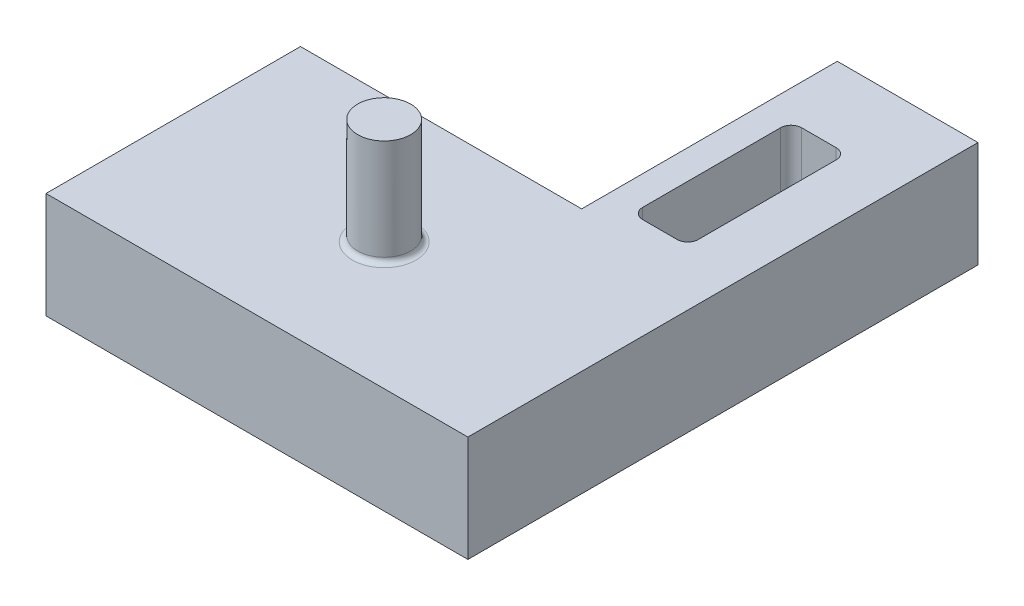
ISO-10303-21;
HEADER;
FILE_DESCRIPTION(('STEP AP214'),'2;1');
FILE_NAME('part.step','',(''),(''),'','','');
FILE_SCHEMA(('AUTOMOTIVE_DESIGN { 1 0 10303 214 1 1 1 1 }'));
ENDSEC;
DATA;
#1=APPLICATION_CONTEXT('core data for automotive mechanical design processes');
#2=APPLICATION_PROTOCOL_DEFINITION('international standard','automotive_design',2000,#1);
#3=PRODUCT_CONTEXT('',#1,'mechanical');
#4=PRODUCT('Part','Part','',(#3));
#5=PRODUCT_RELATED_PRODUCT_CATEGORY('part','',(#4));
#6=PRODUCT_DEFINITION_FORMATION('','',#4);
#7=PRODUCT_DEFINITION_CONTEXT('part definition',#1,'design');
#8=PRODUCT_DEFINITION('design','',#6,#7);
#9=PRODUCT_DEFINITION_SHAPE('','',#8);
#10=(LENGTH_UNIT() NAMED_UNIT(*) SI_UNIT(.MILLI.,.METRE.));
#11=(NAMED_UNIT(*) PLANE_ANGLE_UNIT() SI_UNIT($,.RADIAN.));
#12=(NAMED_UNIT(*) SI_UNIT($,.STERADIAN.) SOLID_ANGLE_UNIT());
#13=UNCERTAINTY_MEASURE_WITH_UNIT(LENGTH_MEASURE(1.E-05),#10,'distance_accuracy_value','');
#14=(GEOMETRIC_REPRESENTATION_CONTEXT(3) GLOBAL_UNCERTAINTY_ASSIGNED_CONTEXT((#13)) GLOBAL_UNIT_ASSIGNED_CONTEXT((#10,
#11,#12)) REPRESENTATION_CONTEXT('',''));
#15=CARTESIAN_POINT('',(0.,0.,0.));
#16=DIRECTION('',(0.,0.,1.));
#17=DIRECTION('',(1.,0.,0.));
#18=AXIS2_PLACEMENT_3D('',#15,#16,#17);
#19=CARTESIAN_POINT('',(0.,10.,0.));
#20=DIRECTION('',(0.,-1.,0.));
#21=DIRECTION('',(0.,0.,-1.));
#22=AXIS2_PLACEMENT_3D('',#19,#20,#21);
#23=PLANE('',#22);
#24=CARTESIAN_POINT('',(0.,10.,-31.5));
#25=DIRECTION('',(0.,-1.,0.));
#26=DIRECTION('',(0.,0.,-1.));
#27=AXIS2_PLACEMENT_3D('',#24,#25,#26);
#28=CIRCLE('',#27,3.);
#29=CARTESIAN_POINT('',(0.,10.,-34.5));
#30=VERTEX_POINT('',#29);
#31=EDGE_CURVE('E11',#30,#30,#28,.T.);
#32=ORIENTED_EDGE('',*,*,#31,.T.);
#33=EDGE_LOOP('',(#32));
#34=FACE_BOUND('',#33,.T.);
#35=DIRECTION('',(-1.,0.,0.));
#36=VECTOR('',#35,1.);
#37=CARTESIAN_POINT('',(11.9999999999999,10.,-60.5));
#38=LINE('',#37,#36);
#39=CARTESIAN_POINT('',(13.6249999999999,10.,-60.5));
#40=VERTEX_POINT('',#39);
#41=CARTESIAN_POINT('',(10.375,10.,-60.5));
#42=VERTEX_POINT('',#41);
#43=EDGE_CURVE('E287',#40,#42,#38,.T.);
#44=ORIENTED_EDGE('',*,*,#43,.F.);
#45=CARTESIAN_POINT('',(13.6249999999999,10.,-59.5));
#46=DIRECTION('',(0.,-1.,0.));
#47=DIRECTION('',(0.,0.,-1.));
#48=AXIS2_PLACEMENT_3D('',#45,#46,#47);
#49=CIRCLE('',#48,1.);
#50=CARTESIAN_POINT('',(14.6249999999999,10.,-59.5));
#51=VERTEX_POINT('',#50);
#52=EDGE_CURVE('E223',#40,#51,#49,.T.);
#53=ORIENTED_EDGE('',*,*,#52,.T.);
#54=DIRECTION('',(0.,0.,-1.));
#55=VECTOR('',#54,1.);
#56=CARTESIAN_POINT('',(14.6249999999999,10.,-60.5));
#57=LINE('',#56,#55);
#58=CARTESIAN_POINT('',(14.6249999999999,10.,-46.5));
#59=VERTEX_POINT('',#58);
#60=EDGE_CURVE('E284',#59,#51,#57,.T.);
#61=ORIENTED_EDGE('',*,*,#60,.F.);
#62=CARTESIAN_POINT('',(13.625,10.,-46.5));
#63=DIRECTION('',(0.,-1.,0.));
#64=DIRECTION('',(0.,0.,-1.));
#65=AXIS2_PLACEMENT_3D('',#62,#63,#64);
#66=CIRCLE('',#65,1.);
#67=CARTESIAN_POINT('',(13.625,10.,-45.5));
#68=VERTEX_POINT('',#67);
#69=EDGE_CURVE('E212',#59,#68,#66,.T.);
#70=ORIENTED_EDGE('',*,*,#69,.T.);
#71=DIRECTION('',(1.,0.,0.));
#72=VECTOR('',#71,1.);
#73=CARTESIAN_POINT('',(12.,10.,-45.5));
#74=LINE('',#73,#72);
#75=CARTESIAN_POINT('',(10.375,10.,-45.5));
#76=VERTEX_POINT('',#75);
#77=EDGE_CURVE('E306',#76,#68,#74,.T.);
#78=ORIENTED_EDGE('',*,*,#77,.F.);
#79=CARTESIAN_POINT('',(10.375,10.,-46.5));
#80=DIRECTION('',(0.,-1.,0.));
#81=DIRECTION('',(0.,0.,-1.));
#82=AXIS2_PLACEMENT_3D('',#79,#80,#81);
#83=CIRCLE('',#82,1.);
#84=CARTESIAN_POINT('',(9.37499999999995,10.,-46.5));
#85=VERTEX_POINT('',#84);
#86=EDGE_CURVE('E208',#76,#85,#83,.T.);
#87=ORIENTED_EDGE('',*,*,#86,.T.);
#88=DIRECTION('',(0.,0.,1.));
#89=VECTOR('',#88,1.);
#90=CARTESIAN_POINT('',(9.37499999999995,10.,-60.5));
#91=LINE('',#90,#89);
#92=CARTESIAN_POINT('',(9.37499999999995,10.,-59.5));
#93=VERTEX_POINT('',#92);
#94=EDGE_CURVE('E296',#93,#85,#91,.T.);
#95=ORIENTED_EDGE('',*,*,#94,.F.);
#96=CARTESIAN_POINT('',(10.375,10.,-59.5));
#97=DIRECTION('',(0.,-1.,0.));
#98=DIRECTION('',(0.,0.,-1.));
#99=AXIS2_PLACEMENT_3D('',#96,#97,#98);
#100=CIRCLE('',#99,1.);
#101=EDGE_CURVE('E217',#93,#42,#100,.T.);
#102=ORIENTED_EDGE('',*,*,#101,.T.);
#103=EDGE_LOOP('',(#44,#53,#61,#70,#78,#87,#95,#102));
#104=FACE_BOUND('',#103,.T.);
#105=DIRECTION('',(0.,0.,1.));
#106=VECTOR('',#105,1.);
#107=CARTESIAN_POINT('',(-19.8937990848772,10.,-77.5));
#108=LINE('',#107,#106);
#109=CARTESIAN_POINT('',(-19.8937990848772,10.,-43.5000000000001));
#110=VERTEX_POINT('',#109);
#111=CARTESIAN_POINT('',(-19.8937990848772,10.,-19.5000000000026));
#112=VERTEX_POINT('',#111);
#113=EDGE_CURVE('E174',#110,#112,#108,.T.);
#114=ORIENTED_EDGE('',*,*,#113,.T.);
#115=DIRECTION('',(-1.,0.,0.));
#116=VECTOR('',#115,1.);
#117=CARTESIAN_POINT('',(-19.8937990848772,10.,-19.5000000000026));
#118=LINE('',#117,#116);
#119=CARTESIAN_POINT('',(19.8937990848773,10.,-19.5000000000026));
#120=VERTEX_POINT('',#119);
#121=EDGE_CURVE('E152',#120,#112,#118,.T.);
#122=ORIENTED_EDGE('',*,*,#121,.F.);
#123=DIRECTION('',(0.,0.,1.));
#124=VECTOR('',#123,1.);
#125=CARTESIAN_POINT('',(19.8937990848774,10.,-77.5));
#126=LINE('',#125,#124);
#127=CARTESIAN_POINT('',(19.8937990848774,10.,-67.6091923824634));
#128=VERTEX_POINT('',#127);
#129=EDGE_CURVE('E175',#128,#120,#126,.T.);
#130=ORIENTED_EDGE('',*,*,#129,.F.);
#131=DIRECTION('',(1.,0.,0.));
#132=VECTOR('',#131,1.);
#133=CARTESIAN_POINT('',(6.62500000000014,10.,-67.6091923824634));
#134=LINE('',#133,#132);
#135=CARTESIAN_POINT('',(6.62500000000014,10.,-67.6091923824634));
#136=VERTEX_POINT('',#135);
#137=EDGE_CURVE('E60',#136,#128,#134,.T.);
#138=ORIENTED_EDGE('',*,*,#137,.F.);
#139=DIRECTION('',(0.,0.,-1.));
#140=VECTOR('',#139,1.);
#141=CARTESIAN_POINT('',(6.62500000000014,10.,-43.5000000000001));
#142=LINE('',#141,#140);
#143=CARTESIAN_POINT('',(6.62500000000014,10.,-43.5000000000001));
#144=VERTEX_POINT('',#143);
#145=EDGE_CURVE('E328',#144,#136,#142,.T.);
#146=ORIENTED_EDGE('',*,*,#145,.F.);
#147=DIRECTION('',(1.,0.,0.));
#148=VECTOR('',#147,1.);
#149=CARTESIAN_POINT('',(6.62500000000014,10.,-43.5000000000001));
#150=LINE('',#149,#148);
#151=EDGE_CURVE('E332',#110,#144,#150,.T.);
#152=ORIENTED_EDGE('',*,*,#151,.F.);
#153=EDGE_LOOP('',(#114,#122,#130,#138,#146,#152));
#154=FACE_BOUND('',#153,.T.);
#155=ADVANCED_FACE('F42',(#34,#104,#154),#23,.F.);
#156=CARTESIAN_POINT('',(0.,0.,0.));
#157=DIRECTION('',(0.,-1.,0.));
#158=DIRECTION('',(0.,0.,-1.));
#159=AXIS2_PLACEMENT_3D('',#156,#157,#158);
#160=PLANE('',#159);
#161=DIRECTION('',(-1.,0.,0.));
#162=VECTOR('',#161,1.);
#163=CARTESIAN_POINT('',(-19.8937990848772,0.,-19.5000000000026));
#164=LINE('',#163,#162);
#165=CARTESIAN_POINT('',(19.8937990848773,0.,-19.5000000000026));
#166=VERTEX_POINT('',#165);
#167=CARTESIAN_POINT('',(-19.8937990848772,0.,-19.5000000000026));
#168=VERTEX_POINT('',#167);
#169=EDGE_CURVE('E68',#166,#168,#164,.T.);
#170=ORIENTED_EDGE('',*,*,#169,.T.);
#171=DIRECTION('',(0.,0.,1.));
#172=VECTOR('',#171,1.);
#173=CARTESIAN_POINT('',(-19.8937990848772,0.,-77.5));
#174=LINE('',#173,#172);
#175=CARTESIAN_POINT('',(-19.8937990848772,0.,-43.5000000000001));
#176=VERTEX_POINT('',#175);
#177=EDGE_CURVE('E166',#176,#168,#174,.T.);
#178=ORIENTED_EDGE('',*,*,#177,.F.);
#179=DIRECTION('',(1.,0.,0.));
#180=VECTOR('',#179,1.);
#181=CARTESIAN_POINT('',(-6.62499999999949,0.,-43.5000000000001));
#182=LINE('',#181,#180);
#183=CARTESIAN_POINT('',(6.62500000000014,0.,-43.5000000000001));
#184=VERTEX_POINT('',#183);
#185=EDGE_CURVE('E327',#176,#184,#182,.T.);
#186=ORIENTED_EDGE('',*,*,#185,.T.);
#187=DIRECTION('',(0.,0.,-1.));
#188=VECTOR('',#187,1.);
#189=CARTESIAN_POINT('',(6.62500000000014,0.,-43.5000000000001));
#190=LINE('',#189,#188);
#191=CARTESIAN_POINT('',(6.62500000000014,0.,-67.6091923824634));
#192=VERTEX_POINT('',#191);
#193=EDGE_CURVE('E320',#184,#192,#190,.T.);
#194=ORIENTED_EDGE('',*,*,#193,.T.);
#195=DIRECTION('',(1.,0.,0.));
#196=VECTOR('',#195,1.);
#197=CARTESIAN_POINT('',(6.62500000000014,0.,-67.6091923824634));
#198=LINE('',#197,#196);
#199=CARTESIAN_POINT('',(19.8937990848774,0.,-67.6091923824634));
#200=VERTEX_POINT('',#199);
#201=EDGE_CURVE('E319',#192,#200,#198,.T.);
#202=ORIENTED_EDGE('',*,*,#201,.T.);
#203=DIRECTION('',(0.,0.,1.));
#204=VECTOR('',#203,1.);
#205=CARTESIAN_POINT('',(19.8937990848774,0.,-77.5));
#206=LINE('',#205,#204);
#207=EDGE_CURVE('E169',#200,#166,#206,.T.);
#208=ORIENTED_EDGE('',*,*,#207,.T.);
#209=EDGE_LOOP('',(#170,#178,#186,#194,#202,#208));
#210=FACE_BOUND('',#209,.T.);
#211=DIRECTION('',(1.,0.,0.));
#212=VECTOR('',#211,1.);
#213=CARTESIAN_POINT('',(12.,0.,-45.5));
#214=LINE('',#213,#212);
#215=CARTESIAN_POINT('',(10.375,0.,-45.5));
#216=VERTEX_POINT('',#215);
#217=CARTESIAN_POINT('',(13.625,0.,-45.5));
#218=VERTEX_POINT('',#217);
#219=EDGE_CURVE('E299',#216,#218,#214,.T.);
#220=ORIENTED_EDGE('',*,*,#219,.T.);
#221=CARTESIAN_POINT('',(13.625,0.,-46.5));
#222=DIRECTION('',(0.,-1.,0.));
#223=DIRECTION('',(0.,0.,-1.));
#224=AXIS2_PLACEMENT_3D('',#221,#222,#223);
#225=CIRCLE('',#224,1.);
#226=CARTESIAN_POINT('',(14.625,0.,-46.5));
#227=VERTEX_POINT('',#226);
#228=EDGE_CURVE('E210',#218,#227,#225,.F.);
#229=ORIENTED_EDGE('',*,*,#228,.T.);
#230=DIRECTION('',(0.,0.,-1.));
#231=VECTOR('',#230,1.);
#232=CARTESIAN_POINT('',(14.6249999999999,0.,-58.));
#233=LINE('',#232,#231);
#234=CARTESIAN_POINT('',(14.6249999999999,0.,-59.5));
#235=VERTEX_POINT('',#234);
#236=EDGE_CURVE('E293',#227,#235,#233,.T.);
#237=ORIENTED_EDGE('',*,*,#236,.T.);
#238=CARTESIAN_POINT('',(13.6249999999999,0.,-59.5));
#239=DIRECTION('',(0.,-1.,0.));
#240=DIRECTION('',(0.,0.,-1.));
#241=AXIS2_PLACEMENT_3D('',#238,#239,#240);
#242=CIRCLE('',#241,1.);
#243=CARTESIAN_POINT('',(13.6249999999999,0.,-60.5));
#244=VERTEX_POINT('',#243);
#245=EDGE_CURVE('E220',#235,#244,#242,.F.);
#246=ORIENTED_EDGE('',*,*,#245,.T.);
#247=DIRECTION('',(-1.,0.,0.));
#248=VECTOR('',#247,1.);
#249=CARTESIAN_POINT('',(11.9999999999999,0.,-60.5));
#250=LINE('',#249,#248);
#251=CARTESIAN_POINT('',(10.375,0.,-60.5));
#252=VERTEX_POINT('',#251);
#253=EDGE_CURVE('E309',#244,#252,#250,.T.);
#254=ORIENTED_EDGE('',*,*,#253,.T.);
#255=CARTESIAN_POINT('',(10.375,0.,-59.5));
#256=DIRECTION('',(0.,-1.,0.));
#257=DIRECTION('',(0.,0.,-1.));
#258=AXIS2_PLACEMENT_3D('',#255,#256,#257);
#259=CIRCLE('',#258,1.);
#260=CARTESIAN_POINT('',(9.37500000000001,0.,-59.5));
#261=VERTEX_POINT('',#260);
#262=EDGE_CURVE('E214',#252,#261,#259,.F.);
#263=ORIENTED_EDGE('',*,*,#262,.T.);
#264=DIRECTION('',(0.,0.,1.));
#265=VECTOR('',#264,1.);
#266=CARTESIAN_POINT('',(9.37500000000001,0.,-45.5));
#267=LINE('',#266,#265);
#268=CARTESIAN_POINT('',(9.37500000000001,0.,-46.5));
#269=VERTEX_POINT('',#268);
#270=EDGE_CURVE('E313',#261,#269,#267,.T.);
#271=ORIENTED_EDGE('',*,*,#270,.T.);
#272=CARTESIAN_POINT('',(10.375,0.,-46.5));
#273=DIRECTION('',(0.,-1.,0.));
#274=DIRECTION('',(0.,0.,-1.));
#275=AXIS2_PLACEMENT_3D('',#272,#273,#274);
#276=CIRCLE('',#275,1.);
#277=EDGE_CURVE('E206',#269,#216,#276,.F.);
#278=ORIENTED_EDGE('',*,*,#277,.T.);
#279=EDGE_LOOP('',(#220,#229,#237,#246,#254,#263,#271,#278));
#280=FACE_BOUND('',#279,.T.);
#281=ADVANCED_FACE('F163',(#210,#280),#160,.T.);
#282=CARTESIAN_POINT('',(-19.8937990848772,10.,-77.5));
#283=DIRECTION('',(1.,0.,0.));
#284=DIRECTION('',(0.,0.,-1.));
#285=AXIS2_PLACEMENT_3D('',#282,#283,#284);
#286=PLANE('',#285);
#287=ORIENTED_EDGE('',*,*,#177,.T.);
#288=DIRECTION('',(0.,1.,0.));
#289=VECTOR('',#288,1.);
#290=CARTESIAN_POINT('',(-19.8937990848772,0.,-19.5000000000026));
#291=LINE('',#290,#289);
#292=EDGE_CURVE('E149',#168,#112,#291,.T.);
#293=ORIENTED_EDGE('',*,*,#292,.T.);
#294=ORIENTED_EDGE('',*,*,#113,.F.);
#295=DIRECTION('',(0.,1.,0.));
#296=VECTOR('',#295,1.);
#297=CARTESIAN_POINT('',(-19.8937990848772,0.,-43.5000000000001));
#298=LINE('',#297,#296);
#299=EDGE_CURVE('E173',#176,#110,#298,.T.);
#300=ORIENTED_EDGE('',*,*,#299,.F.);
#301=EDGE_LOOP('',(#287,#293,#294,#300));
#302=FACE_BOUND('',#301,.T.);
#303=ADVANCED_FACE('F172',(#302),#286,.F.);
#304=CARTESIAN_POINT('',(19.8937990848774,10.,-77.5));
#305=DIRECTION('',(1.,0.,0.));
#306=DIRECTION('',(0.,0.,-1.));
#307=AXIS2_PLACEMENT_3D('',#304,#305,#306);
#308=PLANE('',#307);
#309=DIRECTION('',(0.,1.,0.));
#310=VECTOR('',#309,1.);
#311=CARTESIAN_POINT('',(19.8937990848773,0.,-19.5000000000026));
#312=LINE('',#311,#310);
#313=EDGE_CURVE('E158',#166,#120,#312,.T.);
#314=ORIENTED_EDGE('',*,*,#313,.F.);
#315=ORIENTED_EDGE('',*,*,#207,.F.);
#316=DIRECTION('',(0.,1.,0.));
#317=VECTOR('',#316,1.);
#318=CARTESIAN_POINT('',(19.8937990848774,0.,-67.6091923824634));
#319=LINE('',#318,#317);
#320=EDGE_CURVE('E323',#200,#128,#319,.T.);
#321=ORIENTED_EDGE('',*,*,#320,.T.);
#322=ORIENTED_EDGE('',*,*,#129,.T.);
#323=EDGE_LOOP('',(#314,#315,#321,#322));
#324=FACE_BOUND('',#323,.T.);
#325=ADVANCED_FACE('F253',(#324),#308,.T.);
#326=CARTESIAN_POINT('',(11.9999999999999,10.,-60.5));
#327=DIRECTION('',(0.,0.,1.));
#328=DIRECTION('',(1.,0.,0.));
#329=AXIS2_PLACEMENT_3D('',#326,#327,#328);
#330=PLANE('',#329);
#331=ORIENTED_EDGE('',*,*,#43,.T.);
#332=DIRECTION('',(0.,-1.,0.));
#333=VECTOR('',#332,1.);
#334=CARTESIAN_POINT('',(10.375,0.,-60.5));
#335=LINE('',#334,#333);
#336=EDGE_CURVE('E202',#42,#252,#335,.T.);
#337=ORIENTED_EDGE('',*,*,#336,.T.);
#338=ORIENTED_EDGE('',*,*,#253,.F.);
#339=DIRECTION('',(0.,-1.,0.));
#340=VECTOR('',#339,1.);
#341=CARTESIAN_POINT('',(13.6249999999999,10.,-60.5));
#342=LINE('',#341,#340);
#343=EDGE_CURVE('E199',#244,#40,#342,.F.);
#344=ORIENTED_EDGE('',*,*,#343,.T.);
#345=EDGE_LOOP('',(#331,#337,#338,#344));
#346=FACE_BOUND('',#345,.T.);
#347=ADVANCED_FACE('F368',(#346),#330,.T.);
#348=CARTESIAN_POINT('',(9.37500000000001,10.,-45.5));
#349=DIRECTION('',(1.,0.,0.));
#350=DIRECTION('',(0.,0.,-1.));
#351=AXIS2_PLACEMENT_3D('',#348,#349,#350);
#352=PLANE('',#351);
#353=ORIENTED_EDGE('',*,*,#94,.T.);
#354=DIRECTION('',(0.,-1.,0.));
#355=VECTOR('',#354,1.);
#356=CARTESIAN_POINT('',(9.37500000000001,0.,-46.5));
#357=LINE('',#356,#355);
#358=EDGE_CURVE('E185',#85,#269,#357,.T.);
#359=ORIENTED_EDGE('',*,*,#358,.T.);
#360=ORIENTED_EDGE('',*,*,#270,.F.);
#361=DIRECTION('',(0.,-1.,0.));
#362=VECTOR('',#361,1.);
#363=CARTESIAN_POINT('',(9.37500000000001,10.,-59.5));
#364=LINE('',#363,#362);
#365=EDGE_CURVE('E177',#261,#93,#364,.F.);
#366=ORIENTED_EDGE('',*,*,#365,.T.);
#367=EDGE_LOOP('',(#353,#359,#360,#366));
#368=FACE_BOUND('',#367,.T.);
#369=ADVANCED_FACE('F365',(#368),#352,.T.);
#370=CARTESIAN_POINT('',(12.,10.,-45.5));
#371=DIRECTION('',(0.,0.,-1.));
#372=DIRECTION('',(-1.,0.,0.));
#373=AXIS2_PLACEMENT_3D('',#370,#371,#372);
#374=PLANE('',#373);
#375=ORIENTED_EDGE('',*,*,#219,.F.);
#376=DIRECTION('',(0.,-1.,0.));
#377=VECTOR('',#376,1.);
#378=CARTESIAN_POINT('',(10.375,10.,-45.5));
#379=LINE('',#378,#377);
#380=EDGE_CURVE('E191',#216,#76,#379,.F.);
#381=ORIENTED_EDGE('',*,*,#380,.T.);
#382=ORIENTED_EDGE('',*,*,#77,.T.);
#383=DIRECTION('',(0.,-1.,0.));
#384=VECTOR('',#383,1.);
#385=CARTESIAN_POINT('',(13.625,0.,-45.5));
#386=LINE('',#385,#384);
#387=EDGE_CURVE('E188',#68,#218,#386,.T.);
#388=ORIENTED_EDGE('',*,*,#387,.T.);
#389=EDGE_LOOP('',(#375,#381,#382,#388));
#390=FACE_BOUND('',#389,.T.);
#391=ADVANCED_FACE('F362',(#390),#374,.T.);
#392=CARTESIAN_POINT('',(14.6249999999999,10.,-58.));
#393=DIRECTION('',(-1.,0.,0.));
#394=DIRECTION('',(0.,0.,1.));
#395=AXIS2_PLACEMENT_3D('',#392,#393,#394);
#396=PLANE('',#395);
#397=ORIENTED_EDGE('',*,*,#236,.F.);
#398=DIRECTION('',(0.,-1.,0.));
#399=VECTOR('',#398,1.);
#400=CARTESIAN_POINT('',(14.625,10.,-46.5));
#401=LINE('',#400,#399);
#402=EDGE_CURVE('E197',#227,#59,#401,.F.);
#403=ORIENTED_EDGE('',*,*,#402,.T.);
#404=ORIENTED_EDGE('',*,*,#60,.T.);
#405=DIRECTION('',(0.,-1.,0.));
#406=VECTOR('',#405,1.);
#407=CARTESIAN_POINT('',(14.6249999999999,0.,-59.5));
#408=LINE('',#407,#406);
#409=EDGE_CURVE('E193',#51,#235,#408,.T.);
#410=ORIENTED_EDGE('',*,*,#409,.T.);
#411=EDGE_LOOP('',(#397,#403,#404,#410));
#412=FACE_BOUND('',#411,.T.);
#413=ADVANCED_FACE('F262',(#412),#396,.T.);
#414=CARTESIAN_POINT('',(10.375,10.,-46.5));
#415=DIRECTION('',(0.,1.,0.));
#416=DIRECTION('',(0.,0.,1.));
#417=AXIS2_PLACEMENT_3D('',#414,#415,#416);
#418=CYLINDRICAL_SURFACE('',#417,1.);
#419=ORIENTED_EDGE('',*,*,#86,.F.);
#420=ORIENTED_EDGE('',*,*,#380,.F.);
#421=ORIENTED_EDGE('',*,*,#277,.F.);
#422=ORIENTED_EDGE('',*,*,#358,.F.);
#423=EDGE_LOOP('',(#419,#420,#421,#422));
#424=FACE_BOUND('',#423,.T.);
#425=ADVANCED_FACE('F258',(#424),#418,.F.);
#426=CARTESIAN_POINT('',(13.625,10.,-46.5));
#427=DIRECTION('',(0.,1.,0.));
#428=DIRECTION('',(0.,0.,1.));
#429=AXIS2_PLACEMENT_3D('',#426,#427,#428);
#430=CYLINDRICAL_SURFACE('',#429,1.);
#431=ORIENTED_EDGE('',*,*,#69,.F.);
#432=ORIENTED_EDGE('',*,*,#402,.F.);
#433=ORIENTED_EDGE('',*,*,#228,.F.);
#434=ORIENTED_EDGE('',*,*,#387,.F.);
#435=EDGE_LOOP('',(#431,#432,#433,#434));
#436=FACE_BOUND('',#435,.T.);
#437=ADVANCED_FACE('F261',(#436),#430,.F.);
#438=CARTESIAN_POINT('',(10.375,10.,-59.5));
#439=DIRECTION('',(0.,1.,0.));
#440=DIRECTION('',(0.,0.,1.));
#441=AXIS2_PLACEMENT_3D('',#438,#439,#440);
#442=CYLINDRICAL_SURFACE('',#441,1.);
#443=ORIENTED_EDGE('',*,*,#101,.F.);
#444=ORIENTED_EDGE('',*,*,#365,.F.);
#445=ORIENTED_EDGE('',*,*,#262,.F.);
#446=ORIENTED_EDGE('',*,*,#336,.F.);
#447=EDGE_LOOP('',(#443,#444,#445,#446));
#448=FACE_BOUND('',#447,.T.);
#449=ADVANCED_FACE('F266',(#448),#442,.F.);
#450=CARTESIAN_POINT('',(13.6249999999999,10.,-59.5));
#451=DIRECTION('',(0.,1.,0.));
#452=DIRECTION('',(0.,0.,1.));
#453=AXIS2_PLACEMENT_3D('',#450,#451,#452);
#454=CYLINDRICAL_SURFACE('',#453,1.);
#455=ORIENTED_EDGE('',*,*,#52,.F.);
#456=ORIENTED_EDGE('',*,*,#343,.F.);
#457=ORIENTED_EDGE('',*,*,#245,.F.);
#458=ORIENTED_EDGE('',*,*,#409,.F.);
#459=EDGE_LOOP('',(#455,#456,#457,#458));
#460=FACE_BOUND('',#459,.T.);
#461=ADVANCED_FACE('F269',(#460),#454,.F.);
#462=CARTESIAN_POINT('',(0.,20.,-31.5));
#463=DIRECTION('',(0.,-1.,0.));
#464=DIRECTION('',(0.,0.,-1.));
#465=AXIS2_PLACEMENT_3D('',#462,#463,#464);
#466=CYLINDRICAL_SURFACE('',#465,2.5);
#467=CARTESIAN_POINT('',(0.,10.5,-31.5));
#468=DIRECTION('',(0.,-1.,0.));
#469=DIRECTION('',(0.,0.,-1.));
#470=AXIS2_PLACEMENT_3D('',#467,#468,#469);
#471=CIRCLE('',#470,2.5);
#472=CARTESIAN_POINT('',(0.,10.5,-34.));
#473=VERTEX_POINT('',#472);
#474=EDGE_CURVE('E50',#473,#473,#471,.F.);
#475=ORIENTED_EDGE('',*,*,#474,.T.);
#476=EDGE_LOOP('',(#475));
#477=FACE_BOUND('',#476,.T.);
#478=CARTESIAN_POINT('',(0.,20.,-31.5));
#479=DIRECTION('',(0.,1.,0.));
#480=DIRECTION('',(0.,0.,1.));
#481=AXIS2_PLACEMENT_3D('',#478,#479,#480);
#482=CIRCLE('',#481,2.5);
#483=CARTESIAN_POINT('',(0.,20.,-29.));
#484=VERTEX_POINT('',#483);
#485=EDGE_CURVE('E157',#484,#484,#482,.T.);
#486=ORIENTED_EDGE('',*,*,#485,.F.);
#487=EDGE_LOOP('',(#486));
#488=FACE_BOUND('',#487,.T.);
#489=ADVANCED_FACE('F228',(#477,#488),#466,.T.);
#490=CARTESIAN_POINT('',(0.,20.,-31.5));
#491=DIRECTION('',(0.,1.,0.));
#492=DIRECTION('',(0.,0.,1.));
#493=AXIS2_PLACEMENT_3D('',#490,#491,#492);
#494=PLANE('',#493);
#495=ORIENTED_EDGE('',*,*,#485,.T.);
#496=EDGE_LOOP('',(#495));
#497=FACE_BOUND('',#496,.T.);
#498=ADVANCED_FACE('F233',(#497),#494,.T.);
#499=CARTESIAN_POINT('',(0.,10.5,-31.5));
#500=DIRECTION('',(0.,-1.,0.));
#501=DIRECTION('',(0.,0.,-1.));
#502=AXIS2_PLACEMENT_3D('',#499,#500,#501);
#503=TOROIDAL_SURFACE('',#502,3.,0.5);
#504=ORIENTED_EDGE('',*,*,#31,.F.);
#505=EDGE_LOOP('',(#504));
#506=FACE_BOUND('',#505,.T.);
#507=ORIENTED_EDGE('',*,*,#474,.F.);
#508=EDGE_LOOP('',(#507));
#509=FACE_BOUND('',#508,.T.);
#510=ADVANCED_FACE('F44',(#506,#509),#503,.F.);
#511=CARTESIAN_POINT('',(6.62500000000014,0.,-67.6091923824634));
#512=DIRECTION('',(0.,0.,1.));
#513=DIRECTION('',(1.,0.,0.));
#514=AXIS2_PLACEMENT_3D('',#511,#512,#513);
#515=PLANE('',#514);
#516=ORIENTED_EDGE('',*,*,#137,.T.);
#517=ORIENTED_EDGE('',*,*,#320,.F.);
#518=ORIENTED_EDGE('',*,*,#201,.F.);
#519=DIRECTION('',(0.,1.,0.));
#520=VECTOR('',#519,1.);
#521=CARTESIAN_POINT('',(6.62500000000014,0.,-67.6091923824634));
#522=LINE('',#521,#520);
#523=EDGE_CURVE('E325',#192,#136,#522,.T.);
#524=ORIENTED_EDGE('',*,*,#523,.T.);
#525=EDGE_LOOP('',(#516,#517,#518,#524));
#526=FACE_BOUND('',#525,.T.);
#527=ADVANCED_FACE('F232',(#526),#515,.F.);
#528=CARTESIAN_POINT('',(6.62500000000014,0.,-43.5000000000001));
#529=DIRECTION('',(1.,0.,0.));
#530=DIRECTION('',(0.,0.,-1.));
#531=AXIS2_PLACEMENT_3D('',#528,#529,#530);
#532=PLANE('',#531);
#533=ORIENTED_EDGE('',*,*,#145,.T.);
#534=ORIENTED_EDGE('',*,*,#523,.F.);
#535=ORIENTED_EDGE('',*,*,#193,.F.);
#536=DIRECTION('',(0.,1.,0.));
#537=VECTOR('',#536,1.);
#538=CARTESIAN_POINT('',(6.62500000000014,0.,-43.5000000000001));
#539=LINE('',#538,#537);
#540=EDGE_CURVE('E337',#184,#144,#539,.T.);
#541=ORIENTED_EDGE('',*,*,#540,.T.);
#542=EDGE_LOOP('',(#533,#534,#535,#541));
#543=FACE_BOUND('',#542,.T.);
#544=ADVANCED_FACE('F239',(#543),#532,.F.);
#545=CARTESIAN_POINT('',(6.62500000000014,0.,-43.5000000000001));
#546=DIRECTION('',(0.,0.,1.));
#547=DIRECTION('',(1.,0.,0.));
#548=AXIS2_PLACEMENT_3D('',#545,#546,#547);
#549=PLANE('',#548);
#550=ORIENTED_EDGE('',*,*,#151,.T.);
#551=ORIENTED_EDGE('',*,*,#540,.F.);
#552=ORIENTED_EDGE('',*,*,#185,.F.);
#553=ORIENTED_EDGE('',*,*,#299,.T.);
#554=EDGE_LOOP('',(#550,#551,#552,#553));
#555=FACE_BOUND('',#554,.T.);
#556=ADVANCED_FACE('F341',(#555),#549,.F.);
#557=CARTESIAN_POINT('',(-19.8937990848772,0.,-19.5000000000026));
#558=DIRECTION('',(0.,0.,-1.));
#559=DIRECTION('',(-1.,0.,0.));
#560=AXIS2_PLACEMENT_3D('',#557,#558,#559);
#561=PLANE('',#560);
#562=ORIENTED_EDGE('',*,*,#121,.T.);
#563=ORIENTED_EDGE('',*,*,#292,.F.);
#564=ORIENTED_EDGE('',*,*,#169,.F.);
#565=ORIENTED_EDGE('',*,*,#313,.T.);
#566=EDGE_LOOP('',(#562,#563,#564,#565));
#567=FACE_BOUND('',#566,.T.);
#568=ADVANCED_FACE('F150',(#567),#561,.F.);
#569=CLOSED_SHELL('',(#155,#281,#303,#325,#347,#369,#391,#413,#425,#437,#449,#461,#489,#498,
#510,#527,#544,#556,#568));
#570=MANIFOLD_SOLID_BREP('B2',#569);
#571=ADVANCED_BREP_SHAPE_REPRESENTATION('',(#18,#570),#14);
#572=SHAPE_DEFINITION_REPRESENTATION(#9,#571);
ENDSEC;
END-ISO-10303-21;
